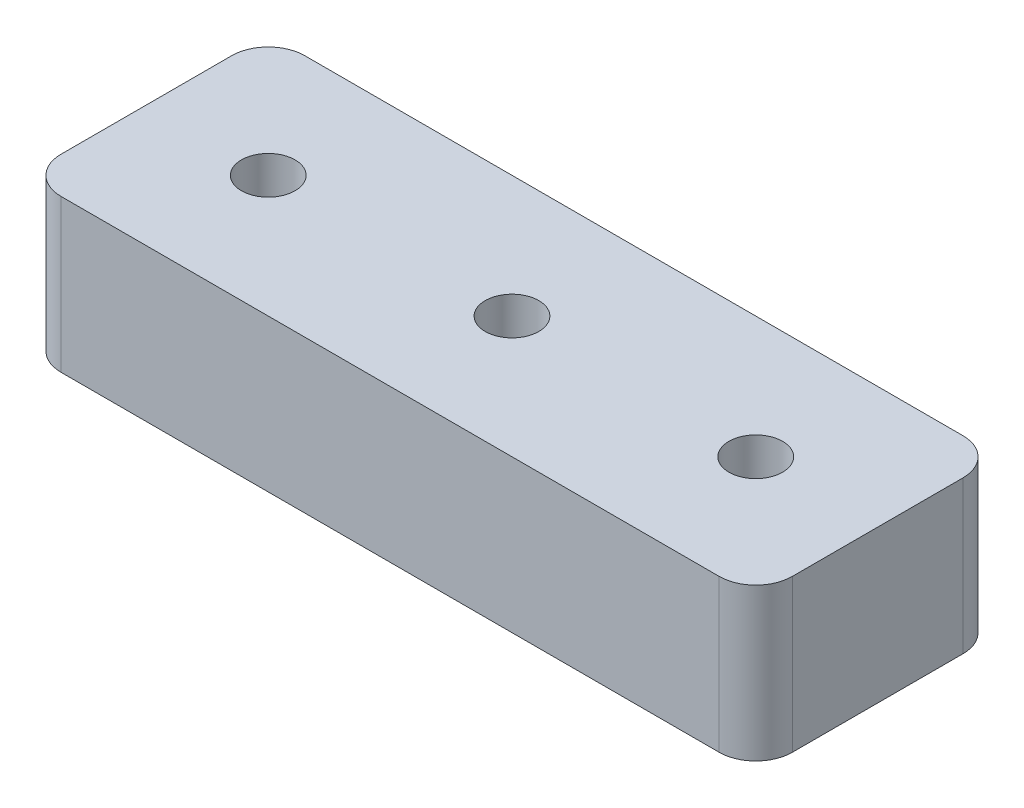
ISO-10303-21;
HEADER;
FILE_DESCRIPTION(('STEP AP214'),'2;1');
FILE_NAME('part.step','',(''),(''),'','','');
FILE_SCHEMA(('AUTOMOTIVE_DESIGN { 1 0 10303 214 1 1 1 1 }'));
ENDSEC;
DATA;
#1=APPLICATION_CONTEXT('core data for automotive mechanical design processes');
#2=APPLICATION_PROTOCOL_DEFINITION('international standard','automotive_design',2000,#1);
#3=PRODUCT_CONTEXT('',#1,'mechanical');
#4=PRODUCT('Part','Part','',(#3));
#5=PRODUCT_RELATED_PRODUCT_CATEGORY('part','',(#4));
#6=PRODUCT_DEFINITION_FORMATION('','',#4);
#7=PRODUCT_DEFINITION_CONTEXT('part definition',#1,'design');
#8=PRODUCT_DEFINITION('design','',#6,#7);
#9=PRODUCT_DEFINITION_SHAPE('','',#8);
#10=(LENGTH_UNIT() NAMED_UNIT(*) SI_UNIT(.MILLI.,.METRE.));
#11=(NAMED_UNIT(*) PLANE_ANGLE_UNIT() SI_UNIT($,.RADIAN.));
#12=(NAMED_UNIT(*) SI_UNIT($,.STERADIAN.) SOLID_ANGLE_UNIT());
#13=UNCERTAINTY_MEASURE_WITH_UNIT(LENGTH_MEASURE(1.E-05),#10,'distance_accuracy_value','');
#14=(GEOMETRIC_REPRESENTATION_CONTEXT(3) GLOBAL_UNCERTAINTY_ASSIGNED_CONTEXT((#13)) GLOBAL_UNIT_ASSIGNED_CONTEXT((#10,
#11,#12)) REPRESENTATION_CONTEXT('',''));
#15=CARTESIAN_POINT('',(0.,0.,0.));
#16=DIRECTION('',(0.,0.,1.));
#17=DIRECTION('',(1.,0.,0.));
#18=AXIS2_PLACEMENT_3D('',#15,#16,#17);
#19=CARTESIAN_POINT('',(0.,6.25,0.));
#20=DIRECTION('',(0.,1.,0.));
#21=DIRECTION('',(0.,0.,1.));
#22=AXIS2_PLACEMENT_3D('',#19,#20,#21);
#23=PLANE('',#22);
#24=CARTESIAN_POINT('',(-20.,6.25,0.));
#25=DIRECTION('',(0.,1.,0.));
#26=DIRECTION('',(0.,0.,1.));
#27=AXIS2_PLACEMENT_3D('',#24,#25,#26);
#28=CIRCLE('',#27,2.2);
#29=CARTESIAN_POINT('',(-20.,6.25,2.2));
#30=VERTEX_POINT('',#29);
#31=EDGE_CURVE('E186',#30,#30,#28,.T.);
#32=ORIENTED_EDGE('',*,*,#31,.F.);
#33=EDGE_LOOP('',(#32));
#34=FACE_BOUND('',#33,.T.);
#35=DIRECTION('',(0.,0.,-1.));
#36=VECTOR('',#35,1.);
#37=CARTESIAN_POINT('',(30.,6.25,-10.));
#38=LINE('',#37,#36);
#39=CARTESIAN_POINT('',(30.,6.25,7.));
#40=VERTEX_POINT('',#39);
#41=CARTESIAN_POINT('',(30.,6.25,-7.));
#42=VERTEX_POINT('',#41);
#43=EDGE_CURVE('E143',#40,#42,#38,.T.);
#44=ORIENTED_EDGE('',*,*,#43,.T.);
#45=CARTESIAN_POINT('',(27.,6.25,-7.));
#46=DIRECTION('',(0.,1.,0.));
#47=DIRECTION('',(0.,0.,1.));
#48=AXIS2_PLACEMENT_3D('',#45,#46,#47);
#49=CIRCLE('',#48,3.);
#50=CARTESIAN_POINT('',(27.,6.25,-10.));
#51=VERTEX_POINT('',#50);
#52=EDGE_CURVE('E158',#42,#51,#49,.T.);
#53=ORIENTED_EDGE('',*,*,#52,.T.);
#54=DIRECTION('',(-1.,0.,0.));
#55=VECTOR('',#54,1.);
#56=CARTESIAN_POINT('',(-30.,6.25,-10.));
#57=LINE('',#56,#55);
#58=CARTESIAN_POINT('',(-27.,6.25,-10.));
#59=VERTEX_POINT('',#58);
#60=EDGE_CURVE('E125',#51,#59,#57,.T.);
#61=ORIENTED_EDGE('',*,*,#60,.T.);
#62=CARTESIAN_POINT('',(-27.,6.25,-7.));
#63=DIRECTION('',(0.,1.,0.));
#64=DIRECTION('',(0.,0.,1.));
#65=AXIS2_PLACEMENT_3D('',#62,#63,#64);
#66=CIRCLE('',#65,3.);
#67=CARTESIAN_POINT('',(-30.,6.25,-7.));
#68=VERTEX_POINT('',#67);
#69=EDGE_CURVE('E153',#59,#68,#66,.T.);
#70=ORIENTED_EDGE('',*,*,#69,.T.);
#71=DIRECTION('',(0.,0.,1.));
#72=VECTOR('',#71,1.);
#73=CARTESIAN_POINT('',(-30.,6.25,-10.));
#74=LINE('',#73,#72);
#75=CARTESIAN_POINT('',(-30.,6.25,7.));
#76=VERTEX_POINT('',#75);
#77=EDGE_CURVE('E169',#68,#76,#74,.T.);
#78=ORIENTED_EDGE('',*,*,#77,.T.);
#79=CARTESIAN_POINT('',(-27.,6.25,7.));
#80=DIRECTION('',(0.,1.,0.));
#81=DIRECTION('',(0.,0.,1.));
#82=AXIS2_PLACEMENT_3D('',#79,#80,#81);
#83=CIRCLE('',#82,3.);
#84=CARTESIAN_POINT('',(-27.,6.25,10.));
#85=VERTEX_POINT('',#84);
#86=EDGE_CURVE('E61',#76,#85,#83,.T.);
#87=ORIENTED_EDGE('',*,*,#86,.T.);
#88=DIRECTION('',(1.,0.,0.));
#89=VECTOR('',#88,1.);
#90=CARTESIAN_POINT('',(-30.,6.25,10.));
#91=LINE('',#90,#89);
#92=CARTESIAN_POINT('',(27.,6.25,10.));
#93=VERTEX_POINT('',#92);
#94=EDGE_CURVE('E144',#85,#93,#91,.T.);
#95=ORIENTED_EDGE('',*,*,#94,.T.);
#96=CARTESIAN_POINT('',(27.,6.25,7.00000000000001));
#97=DIRECTION('',(0.,1.,0.));
#98=DIRECTION('',(0.,0.,1.));
#99=AXIS2_PLACEMENT_3D('',#96,#97,#98);
#100=CIRCLE('',#99,3.);
#101=EDGE_CURVE('E156',#93,#40,#100,.T.);
#102=ORIENTED_EDGE('',*,*,#101,.T.);
#103=EDGE_LOOP('',(#44,#53,#61,#70,#78,#87,#95,#102));
#104=FACE_BOUND('',#103,.T.);
#105=CARTESIAN_POINT('',(0.,6.25,0.));
#106=DIRECTION('',(0.,1.,0.));
#107=DIRECTION('',(0.,0.,1.));
#108=AXIS2_PLACEMENT_3D('',#105,#106,#107);
#109=CIRCLE('',#108,2.2);
#110=CARTESIAN_POINT('',(0.,6.25,2.2));
#111=VERTEX_POINT('',#110);
#112=EDGE_CURVE('E138',#111,#111,#109,.T.);
#113=ORIENTED_EDGE('',*,*,#112,.F.);
#114=EDGE_LOOP('',(#113));
#115=FACE_BOUND('',#114,.T.);
#116=CARTESIAN_POINT('',(20.,6.25,0.));
#117=DIRECTION('',(0.,1.,0.));
#118=DIRECTION('',(0.,0.,-1.));
#119=AXIS2_PLACEMENT_3D('',#116,#117,#118);
#120=CIRCLE('',#119,2.2);
#121=CARTESIAN_POINT('',(20.,6.25,-2.2));
#122=VERTEX_POINT('',#121);
#123=EDGE_CURVE('E192',#122,#122,#120,.T.);
#124=ORIENTED_EDGE('',*,*,#123,.F.);
#125=EDGE_LOOP('',(#124));
#126=FACE_BOUND('',#125,.T.);
#127=ADVANCED_FACE('F39',(#34,#104,#115,#126),#23,.T.);
#128=CARTESIAN_POINT('',(0.,-6.25,0.));
#129=DIRECTION('',(0.,1.,0.));
#130=DIRECTION('',(0.,0.,1.));
#131=AXIS2_PLACEMENT_3D('',#128,#129,#130);
#132=PLANE('',#131);
#133=DIRECTION('',(-1.,0.,0.));
#134=VECTOR('',#133,1.);
#135=CARTESIAN_POINT('',(-30.,-6.25,-10.));
#136=LINE('',#135,#134);
#137=CARTESIAN_POINT('',(27.,-6.25,-10.));
#138=VERTEX_POINT('',#137);
#139=CARTESIAN_POINT('',(-27.,-6.25,-10.));
#140=VERTEX_POINT('',#139);
#141=EDGE_CURVE('E122',#138,#140,#136,.T.);
#142=ORIENTED_EDGE('',*,*,#141,.F.);
#143=CARTESIAN_POINT('',(27.,-6.25,-7.));
#144=DIRECTION('',(0.,1.,0.));
#145=DIRECTION('',(0.,0.,1.));
#146=AXIS2_PLACEMENT_3D('',#143,#144,#145);
#147=CIRCLE('',#146,3.);
#148=CARTESIAN_POINT('',(30.,-6.25,-7.));
#149=VERTEX_POINT('',#148);
#150=EDGE_CURVE('E105',#138,#149,#147,.F.);
#151=ORIENTED_EDGE('',*,*,#150,.T.);
#152=DIRECTION('',(0.,0.,-1.));
#153=VECTOR('',#152,1.);
#154=CARTESIAN_POINT('',(30.,-6.25,-10.));
#155=LINE('',#154,#153);
#156=CARTESIAN_POINT('',(30.,-6.25,7.));
#157=VERTEX_POINT('',#156);
#158=EDGE_CURVE('E133',#157,#149,#155,.T.);
#159=ORIENTED_EDGE('',*,*,#158,.F.);
#160=CARTESIAN_POINT('',(27.,-6.25,7.00000000000001));
#161=DIRECTION('',(0.,1.,0.));
#162=DIRECTION('',(0.,0.,1.));
#163=AXIS2_PLACEMENT_3D('',#160,#161,#162);
#164=CIRCLE('',#163,3.);
#165=CARTESIAN_POINT('',(27.,-6.25,10.));
#166=VERTEX_POINT('',#165);
#167=EDGE_CURVE('E116',#157,#166,#164,.F.);
#168=ORIENTED_EDGE('',*,*,#167,.T.);
#169=DIRECTION('',(1.,0.,0.));
#170=VECTOR('',#169,1.);
#171=CARTESIAN_POINT('',(-30.,-6.25,10.));
#172=LINE('',#171,#170);
#173=CARTESIAN_POINT('',(-27.,-6.25,10.));
#174=VERTEX_POINT('',#173);
#175=EDGE_CURVE('E136',#174,#166,#172,.T.);
#176=ORIENTED_EDGE('',*,*,#175,.F.);
#177=CARTESIAN_POINT('',(-27.,-6.25,7.));
#178=DIRECTION('',(0.,1.,0.));
#179=DIRECTION('',(0.,0.,1.));
#180=AXIS2_PLACEMENT_3D('',#177,#178,#179);
#181=CIRCLE('',#180,3.);
#182=CARTESIAN_POINT('',(-30.,-6.25,7.));
#183=VERTEX_POINT('',#182);
#184=EDGE_CURVE('E147',#174,#183,#181,.F.);
#185=ORIENTED_EDGE('',*,*,#184,.T.);
#186=DIRECTION('',(0.,0.,1.));
#187=VECTOR('',#186,1.);
#188=CARTESIAN_POINT('',(-30.,-6.25,-10.));
#189=LINE('',#188,#187);
#190=CARTESIAN_POINT('',(-30.,-6.25,-7.));
#191=VERTEX_POINT('',#190);
#192=EDGE_CURVE('E132',#191,#183,#189,.T.);
#193=ORIENTED_EDGE('',*,*,#192,.F.);
#194=CARTESIAN_POINT('',(-27.,-6.25,-7.));
#195=DIRECTION('',(0.,1.,0.));
#196=DIRECTION('',(0.,0.,1.));
#197=AXIS2_PLACEMENT_3D('',#194,#195,#196);
#198=CIRCLE('',#197,3.);
#199=EDGE_CURVE('E126',#191,#140,#198,.F.);
#200=ORIENTED_EDGE('',*,*,#199,.T.);
#201=EDGE_LOOP('',(#142,#151,#159,#168,#176,#185,#193,#200));
#202=FACE_BOUND('',#201,.T.);
#203=CARTESIAN_POINT('',(0.,-6.25,0.));
#204=DIRECTION('',(0.,1.,0.));
#205=DIRECTION('',(0.,0.,1.));
#206=AXIS2_PLACEMENT_3D('',#203,#204,#205);
#207=CIRCLE('',#206,2.2);
#208=CARTESIAN_POINT('',(0.,-6.25,2.2));
#209=VERTEX_POINT('',#208);
#210=EDGE_CURVE('E183',#209,#209,#207,.T.);
#211=ORIENTED_EDGE('',*,*,#210,.T.);
#212=EDGE_LOOP('',(#211));
#213=FACE_BOUND('',#212,.T.);
#214=CARTESIAN_POINT('',(-20.,-6.25,0.));
#215=DIRECTION('',(0.,1.,0.));
#216=DIRECTION('',(0.,0.,1.));
#217=AXIS2_PLACEMENT_3D('',#214,#215,#216);
#218=CIRCLE('',#217,2.2);
#219=CARTESIAN_POINT('',(-20.,-6.25,2.2));
#220=VERTEX_POINT('',#219);
#221=EDGE_CURVE('E189',#220,#220,#218,.T.);
#222=ORIENTED_EDGE('',*,*,#221,.T.);
#223=EDGE_LOOP('',(#222));
#224=FACE_BOUND('',#223,.T.);
#225=CARTESIAN_POINT('',(20.,-6.25,0.));
#226=DIRECTION('',(0.,1.,0.));
#227=DIRECTION('',(0.,0.,-1.));
#228=AXIS2_PLACEMENT_3D('',#225,#226,#227);
#229=CIRCLE('',#228,2.2);
#230=CARTESIAN_POINT('',(20.,-6.25,-2.2));
#231=VERTEX_POINT('',#230);
#232=EDGE_CURVE('E195',#231,#231,#229,.T.);
#233=ORIENTED_EDGE('',*,*,#232,.T.);
#234=EDGE_LOOP('',(#233));
#235=FACE_BOUND('',#234,.T.);
#236=ADVANCED_FACE('F129',(#202,#213,#224,#235),#132,.F.);
#237=CARTESIAN_POINT('',(30.,6.25,-10.));
#238=DIRECTION('',(-1.,0.,0.));
#239=DIRECTION('',(0.,0.,1.));
#240=AXIS2_PLACEMENT_3D('',#237,#238,#239);
#241=PLANE('',#240);
#242=ORIENTED_EDGE('',*,*,#158,.T.);
#243=DIRECTION('',(0.,-1.,0.));
#244=VECTOR('',#243,1.);
#245=CARTESIAN_POINT('',(30.,6.25,-7.));
#246=LINE('',#245,#244);
#247=EDGE_CURVE('E110',#149,#42,#246,.F.);
#248=ORIENTED_EDGE('',*,*,#247,.T.);
#249=ORIENTED_EDGE('',*,*,#43,.F.);
#250=DIRECTION('',(0.,-1.,0.));
#251=VECTOR('',#250,1.);
#252=CARTESIAN_POINT('',(30.,6.25,7.));
#253=LINE('',#252,#251);
#254=EDGE_CURVE('E115',#40,#157,#253,.T.);
#255=ORIENTED_EDGE('',*,*,#254,.T.);
#256=EDGE_LOOP('',(#242,#248,#249,#255));
#257=FACE_BOUND('',#256,.T.);
#258=ADVANCED_FACE('F210',(#257),#241,.F.);
#259=CARTESIAN_POINT('',(-30.,6.25,-10.));
#260=DIRECTION('',(0.,0.,1.));
#261=DIRECTION('',(1.,0.,0.));
#262=AXIS2_PLACEMENT_3D('',#259,#260,#261);
#263=PLANE('',#262);
#264=ORIENTED_EDGE('',*,*,#60,.F.);
#265=DIRECTION('',(0.,-1.,0.));
#266=VECTOR('',#265,1.);
#267=CARTESIAN_POINT('',(27.,6.25,-10.));
#268=LINE('',#267,#266);
#269=EDGE_CURVE('E109',#51,#138,#268,.T.);
#270=ORIENTED_EDGE('',*,*,#269,.T.);
#271=ORIENTED_EDGE('',*,*,#141,.T.);
#272=DIRECTION('',(0.,-1.,0.));
#273=VECTOR('',#272,1.);
#274=CARTESIAN_POINT('',(-27.,6.25,-10.));
#275=LINE('',#274,#273);
#276=EDGE_CURVE('E127',#140,#59,#275,.F.);
#277=ORIENTED_EDGE('',*,*,#276,.T.);
#278=EDGE_LOOP('',(#264,#270,#271,#277));
#279=FACE_BOUND('',#278,.T.);
#280=ADVANCED_FACE('F121',(#279),#263,.F.);
#281=CARTESIAN_POINT('',(-30.,6.25,-10.));
#282=DIRECTION('',(1.,0.,0.));
#283=DIRECTION('',(0.,0.,-1.));
#284=AXIS2_PLACEMENT_3D('',#281,#282,#283);
#285=PLANE('',#284);
#286=ORIENTED_EDGE('',*,*,#192,.T.);
#287=DIRECTION('',(0.,-1.,0.));
#288=VECTOR('',#287,1.);
#289=CARTESIAN_POINT('',(-30.,6.25,7.));
#290=LINE('',#289,#288);
#291=EDGE_CURVE('E11',#183,#76,#290,.F.);
#292=ORIENTED_EDGE('',*,*,#291,.T.);
#293=ORIENTED_EDGE('',*,*,#77,.F.);
#294=DIRECTION('',(0.,-1.,0.));
#295=VECTOR('',#294,1.);
#296=CARTESIAN_POINT('',(-30.,6.25,-7.));
#297=LINE('',#296,#295);
#298=EDGE_CURVE('E47',#68,#191,#297,.T.);
#299=ORIENTED_EDGE('',*,*,#298,.T.);
#300=EDGE_LOOP('',(#286,#292,#293,#299));
#301=FACE_BOUND('',#300,.T.);
#302=ADVANCED_FACE('F167',(#301),#285,.F.);
#303=CARTESIAN_POINT('',(-30.,6.25,10.));
#304=DIRECTION('',(0.,0.,-1.));
#305=DIRECTION('',(-1.,0.,0.));
#306=AXIS2_PLACEMENT_3D('',#303,#304,#305);
#307=PLANE('',#306);
#308=ORIENTED_EDGE('',*,*,#175,.T.);
#309=DIRECTION('',(0.,-1.,0.));
#310=VECTOR('',#309,1.);
#311=CARTESIAN_POINT('',(27.,6.25,10.));
#312=LINE('',#311,#310);
#313=EDGE_CURVE('E54',#166,#93,#312,.F.);
#314=ORIENTED_EDGE('',*,*,#313,.T.);
#315=ORIENTED_EDGE('',*,*,#94,.F.);
#316=DIRECTION('',(0.,-1.,0.));
#317=VECTOR('',#316,1.);
#318=CARTESIAN_POINT('',(-27.,6.25,10.));
#319=LINE('',#318,#317);
#320=EDGE_CURVE('E160',#85,#174,#319,.T.);
#321=ORIENTED_EDGE('',*,*,#320,.T.);
#322=EDGE_LOOP('',(#308,#314,#315,#321));
#323=FACE_BOUND('',#322,.T.);
#324=ADVANCED_FACE('F176',(#323),#307,.F.);
#325=CARTESIAN_POINT('',(0.,6.25,0.));
#326=DIRECTION('',(0.,-1.,0.));
#327=DIRECTION('',(0.,0.,-1.));
#328=AXIS2_PLACEMENT_3D('',#325,#326,#327);
#329=CYLINDRICAL_SURFACE('',#328,2.2);
#330=ORIENTED_EDGE('',*,*,#112,.T.);
#331=EDGE_LOOP('',(#330));
#332=FACE_BOUND('',#331,.T.);
#333=ORIENTED_EDGE('',*,*,#210,.F.);
#334=EDGE_LOOP('',(#333));
#335=FACE_BOUND('',#334,.T.);
#336=ADVANCED_FACE('F214',(#332,#335),#329,.F.);
#337=CARTESIAN_POINT('',(-20.,6.25,0.));
#338=DIRECTION('',(0.,-1.,0.));
#339=DIRECTION('',(0.,0.,-1.));
#340=AXIS2_PLACEMENT_3D('',#337,#338,#339);
#341=CYLINDRICAL_SURFACE('',#340,2.2);
#342=ORIENTED_EDGE('',*,*,#31,.T.);
#343=EDGE_LOOP('',(#342));
#344=FACE_BOUND('',#343,.T.);
#345=ORIENTED_EDGE('',*,*,#221,.F.);
#346=EDGE_LOOP('',(#345));
#347=FACE_BOUND('',#346,.T.);
#348=ADVANCED_FACE('F244',(#344,#347),#341,.F.);
#349=CARTESIAN_POINT('',(20.,6.25,0.));
#350=DIRECTION('',(0.,-1.,0.));
#351=DIRECTION('',(0.,0.,-1.));
#352=AXIS2_PLACEMENT_3D('',#349,#350,#351);
#353=CYLINDRICAL_SURFACE('',#352,2.2);
#354=ORIENTED_EDGE('',*,*,#123,.T.);
#355=EDGE_LOOP('',(#354));
#356=FACE_BOUND('',#355,.T.);
#357=ORIENTED_EDGE('',*,*,#232,.F.);
#358=EDGE_LOOP('',(#357));
#359=FACE_BOUND('',#358,.T.);
#360=ADVANCED_FACE('F201',(#356,#359),#353,.F.);
#361=CARTESIAN_POINT('',(27.,6.25,-7.));
#362=DIRECTION('',(0.,-1.,0.));
#363=DIRECTION('',(0.,0.,-1.));
#364=AXIS2_PLACEMENT_3D('',#361,#362,#363);
#365=CYLINDRICAL_SURFACE('',#364,3.);
#366=ORIENTED_EDGE('',*,*,#52,.F.);
#367=ORIENTED_EDGE('',*,*,#247,.F.);
#368=ORIENTED_EDGE('',*,*,#150,.F.);
#369=ORIENTED_EDGE('',*,*,#269,.F.);
#370=EDGE_LOOP('',(#366,#367,#368,#369));
#371=FACE_BOUND('',#370,.T.);
#372=ADVANCED_FACE('F108',(#371),#365,.T.);
#373=CARTESIAN_POINT('',(27.,6.25,7.00000000000001));
#374=DIRECTION('',(0.,-1.,0.));
#375=DIRECTION('',(0.,0.,-1.));
#376=AXIS2_PLACEMENT_3D('',#373,#374,#375);
#377=CYLINDRICAL_SURFACE('',#376,3.);
#378=ORIENTED_EDGE('',*,*,#101,.F.);
#379=ORIENTED_EDGE('',*,*,#313,.F.);
#380=ORIENTED_EDGE('',*,*,#167,.F.);
#381=ORIENTED_EDGE('',*,*,#254,.F.);
#382=EDGE_LOOP('',(#378,#379,#380,#381));
#383=FACE_BOUND('',#382,.T.);
#384=ADVANCED_FACE('F228',(#383),#377,.T.);
#385=CARTESIAN_POINT('',(-27.,6.25,7.));
#386=DIRECTION('',(0.,-1.,0.));
#387=DIRECTION('',(0.,0.,-1.));
#388=AXIS2_PLACEMENT_3D('',#385,#386,#387);
#389=CYLINDRICAL_SURFACE('',#388,3.);
#390=ORIENTED_EDGE('',*,*,#86,.F.);
#391=ORIENTED_EDGE('',*,*,#291,.F.);
#392=ORIENTED_EDGE('',*,*,#184,.F.);
#393=ORIENTED_EDGE('',*,*,#320,.F.);
#394=EDGE_LOOP('',(#390,#391,#392,#393));
#395=FACE_BOUND('',#394,.T.);
#396=ADVANCED_FACE('F175',(#395),#389,.T.);
#397=CARTESIAN_POINT('',(-27.,6.25,-7.));
#398=DIRECTION('',(0.,-1.,0.));
#399=DIRECTION('',(0.,0.,-1.));
#400=AXIS2_PLACEMENT_3D('',#397,#398,#399);
#401=CYLINDRICAL_SURFACE('',#400,3.);
#402=ORIENTED_EDGE('',*,*,#69,.F.);
#403=ORIENTED_EDGE('',*,*,#276,.F.);
#404=ORIENTED_EDGE('',*,*,#199,.F.);
#405=ORIENTED_EDGE('',*,*,#298,.F.);
#406=EDGE_LOOP('',(#402,#403,#404,#405));
#407=FACE_BOUND('',#406,.T.);
#408=ADVANCED_FACE('F41',(#407),#401,.T.);
#409=CLOSED_SHELL('',(#127,#236,#258,#280,#302,#324,#336,#348,#360,#372,#384,#396,#408));
#410=MANIFOLD_SOLID_BREP('B2',#409);
#411=ADVANCED_BREP_SHAPE_REPRESENTATION('',(#18,#410),#14);
#412=SHAPE_DEFINITION_REPRESENTATION(#9,#411);
ENDSEC;
END-ISO-10303-21;
